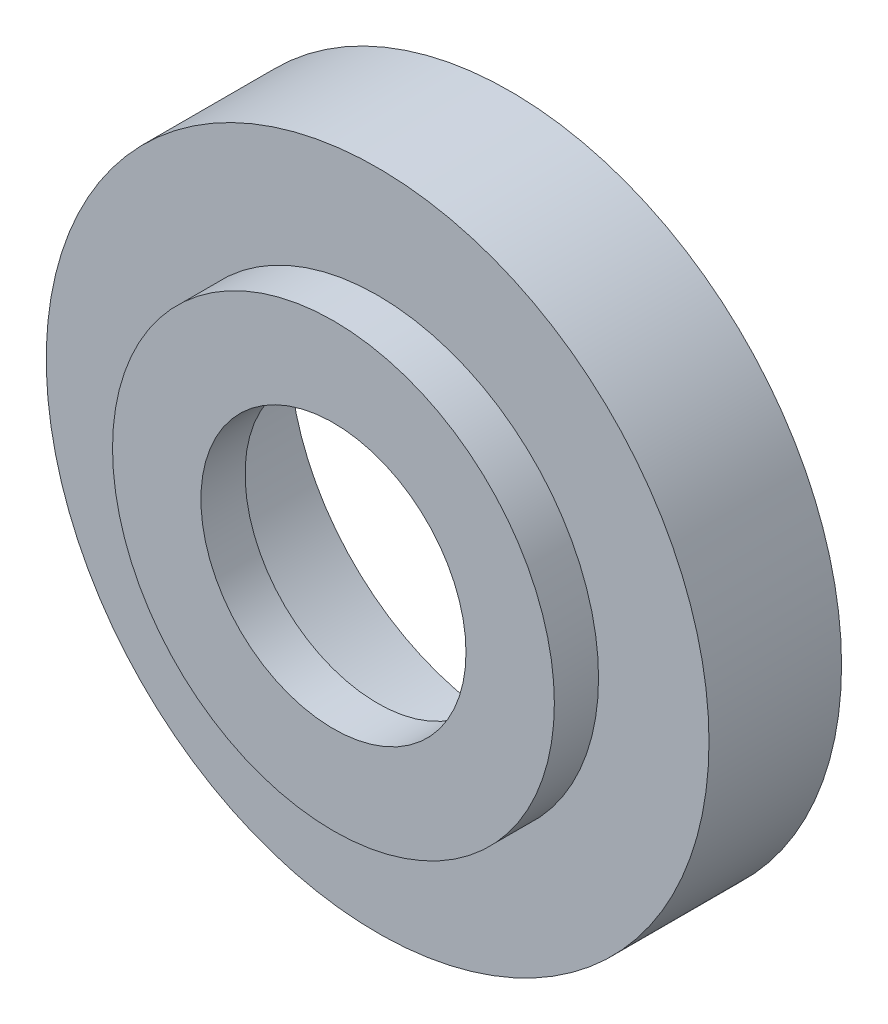
ISO-10303-21;
HEADER;
FILE_DESCRIPTION(('STEP AP214'),'2;1');
FILE_NAME('part.step','',(''),(''),'','','');
FILE_SCHEMA(('AUTOMOTIVE_DESIGN { 1 0 10303 214 1 1 1 1 }'));
ENDSEC;
DATA;
#1=APPLICATION_CONTEXT('core data for automotive mechanical design processes');
#2=APPLICATION_PROTOCOL_DEFINITION('international standard','automotive_design',2000,#1);
#3=PRODUCT_CONTEXT('',#1,'mechanical');
#4=PRODUCT('Part','Part','',(#3));
#5=PRODUCT_RELATED_PRODUCT_CATEGORY('part','',(#4));
#6=PRODUCT_DEFINITION_FORMATION('','',#4);
#7=PRODUCT_DEFINITION_CONTEXT('part definition',#1,'design');
#8=PRODUCT_DEFINITION('design','',#6,#7);
#9=PRODUCT_DEFINITION_SHAPE('','',#8);
#10=(LENGTH_UNIT() NAMED_UNIT(*) SI_UNIT(.MILLI.,.METRE.));
#11=(NAMED_UNIT(*) PLANE_ANGLE_UNIT() SI_UNIT($,.RADIAN.));
#12=(NAMED_UNIT(*) SI_UNIT($,.STERADIAN.) SOLID_ANGLE_UNIT());
#13=UNCERTAINTY_MEASURE_WITH_UNIT(LENGTH_MEASURE(1.E-05),#10,'distance_accuracy_value','');
#14=(GEOMETRIC_REPRESENTATION_CONTEXT(3) GLOBAL_UNCERTAINTY_ASSIGNED_CONTEXT((#13)) GLOBAL_UNIT_ASSIGNED_CONTEXT((#10,
#11,#12)) REPRESENTATION_CONTEXT('',''));
#15=CARTESIAN_POINT('',(0.,0.,0.));
#16=DIRECTION('',(0.,0.,1.));
#17=DIRECTION('',(1.,0.,0.));
#18=AXIS2_PLACEMENT_3D('',#15,#16,#17);
#19=CARTESIAN_POINT('',(0.,0.,2.));
#20=DIRECTION('',(0.,0.,1.));
#21=DIRECTION('',(1.,0.,0.));
#22=AXIS2_PLACEMENT_3D('',#19,#20,#21);
#23=PLANE('',#22);
#24=CARTESIAN_POINT('',(0.,0.,2.));
#25=DIRECTION('',(0.,0.,1.));
#26=DIRECTION('',(1.,0.,0.));
#27=AXIS2_PLACEMENT_3D('',#24,#25,#26);
#28=CIRCLE('',#27,2.5);
#29=CARTESIAN_POINT('',(2.5,0.,2.));
#30=VERTEX_POINT('',#29);
#31=EDGE_CURVE('E12',#30,#30,#28,.T.);
#32=ORIENTED_EDGE('',*,*,#31,.T.);
#33=EDGE_LOOP('',(#32));
#34=FACE_BOUND('',#33,.T.);
#35=CARTESIAN_POINT('',(0.,0.,2.));
#36=DIRECTION('',(0.,0.,1.));
#37=DIRECTION('',(1.,0.,0.));
#38=AXIS2_PLACEMENT_3D('',#35,#36,#37);
#39=CIRCLE('',#38,1.5);
#40=CARTESIAN_POINT('',(1.5,0.,2.));
#41=VERTEX_POINT('',#40);
#42=EDGE_CURVE('E70',#41,#41,#39,.T.);
#43=ORIENTED_EDGE('',*,*,#42,.F.);
#44=EDGE_LOOP('',(#43));
#45=FACE_BOUND('',#44,.T.);
#46=ADVANCED_FACE('F59',(#34,#45),#23,.T.);
#47=CARTESIAN_POINT('',(0.,0.,1.5));
#48=DIRECTION('',(0.,0.,1.));
#49=DIRECTION('',(1.,0.,0.));
#50=AXIS2_PLACEMENT_3D('',#47,#48,#49);
#51=PLANE('',#50);
#52=CARTESIAN_POINT('',(0.,0.,1.5));
#53=DIRECTION('',(0.,0.,1.));
#54=DIRECTION('',(1.,0.,0.));
#55=AXIS2_PLACEMENT_3D('',#52,#53,#54);
#56=CIRCLE('',#55,2.5);
#57=CARTESIAN_POINT('',(2.5,0.,1.5));
#58=VERTEX_POINT('',#57);
#59=EDGE_CURVE('E63',#58,#58,#56,.T.);
#60=ORIENTED_EDGE('',*,*,#59,.F.);
#61=EDGE_LOOP('',(#60));
#62=FACE_BOUND('',#61,.T.);
#63=CARTESIAN_POINT('',(0.,0.,1.5));
#64=DIRECTION('',(0.,0.,1.));
#65=DIRECTION('',(1.,0.,0.));
#66=AXIS2_PLACEMENT_3D('',#63,#64,#65);
#67=CIRCLE('',#66,1.5);
#68=CARTESIAN_POINT('',(1.5,0.,1.5));
#69=VERTEX_POINT('',#68);
#70=EDGE_CURVE('E72',#69,#69,#67,.T.);
#71=ORIENTED_EDGE('',*,*,#70,.T.);
#72=EDGE_LOOP('',(#71));
#73=FACE_BOUND('',#72,.T.);
#74=ADVANCED_FACE('F82',(#62,#73),#51,.F.);
#75=CARTESIAN_POINT('',(0.,0.,2.));
#76=DIRECTION('',(0.,0.,-1.));
#77=DIRECTION('',(-1.,0.,0.));
#78=AXIS2_PLACEMENT_3D('',#75,#76,#77);
#79=CYLINDRICAL_SURFACE('',#78,2.5);
#80=ORIENTED_EDGE('',*,*,#31,.F.);
#81=EDGE_LOOP('',(#80));
#82=FACE_BOUND('',#81,.T.);
#83=ORIENTED_EDGE('',*,*,#59,.T.);
#84=EDGE_LOOP('',(#83));
#85=FACE_BOUND('',#84,.T.);
#86=ADVANCED_FACE('F61',(#82,#85),#79,.T.);
#87=CARTESIAN_POINT('',(0.,0.,2.));
#88=DIRECTION('',(0.,0.,-1.));
#89=DIRECTION('',(-1.,0.,0.));
#90=AXIS2_PLACEMENT_3D('',#87,#88,#89);
#91=CYLINDRICAL_SURFACE('',#90,1.5);
#92=ORIENTED_EDGE('',*,*,#42,.T.);
#93=EDGE_LOOP('',(#92));
#94=FACE_BOUND('',#93,.T.);
#95=ORIENTED_EDGE('',*,*,#70,.F.);
#96=EDGE_LOOP('',(#95));
#97=FACE_BOUND('',#96,.T.);
#98=ADVANCED_FACE('F78',(#94,#97),#91,.F.);
#99=CLOSED_SHELL('',(#46,#74,#86,#98));
#100=MANIFOLD_SOLID_BREP('B2',#99);
#101=CARTESIAN_POINT('',(0.,0.,1.5));
#102=DIRECTION('',(0.,0.,-1.));
#103=DIRECTION('',(-1.,0.,0.));
#104=AXIS2_PLACEMENT_3D('',#101,#102,#103);
#105=CYLINDRICAL_SURFACE('',#104,2.5);
#106=CARTESIAN_POINT('',(0.,0.,1.5));
#107=DIRECTION('',(0.,0.,1.));
#108=DIRECTION('',(1.,0.,0.));
#109=AXIS2_PLACEMENT_3D('',#106,#107,#108);
#110=CIRCLE('',#109,2.5);
#111=CARTESIAN_POINT('',(2.5,0.,1.5));
#112=VERTEX_POINT('',#111);
#113=EDGE_CURVE('E139',#112,#112,#110,.T.);
#114=ORIENTED_EDGE('',*,*,#113,.T.);
#115=EDGE_LOOP('',(#114));
#116=FACE_BOUND('',#115,.T.);
#117=CARTESIAN_POINT('',(0.,0.,0.));
#118=DIRECTION('',(0.,0.,1.));
#119=DIRECTION('',(1.,0.,0.));
#120=AXIS2_PLACEMENT_3D('',#117,#118,#119);
#121=CIRCLE('',#120,2.5);
#122=CARTESIAN_POINT('',(2.5,0.,0.));
#123=VERTEX_POINT('',#122);
#124=EDGE_CURVE('E146',#123,#123,#121,.T.);
#125=ORIENTED_EDGE('',*,*,#124,.F.);
#126=EDGE_LOOP('',(#125));
#127=FACE_BOUND('',#126,.T.);
#128=ADVANCED_FACE('F131',(#116,#127),#105,.F.);
#129=CARTESIAN_POINT('',(0.,0.,1.5));
#130=DIRECTION('',(0.,0.,-1.));
#131=DIRECTION('',(-1.,0.,0.));
#132=AXIS2_PLACEMENT_3D('',#129,#130,#131);
#133=CYLINDRICAL_SURFACE('',#132,3.75);
#134=CARTESIAN_POINT('',(0.,0.,1.5));
#135=DIRECTION('',(0.,0.,1.));
#136=DIRECTION('',(1.,0.,0.));
#137=AXIS2_PLACEMENT_3D('',#134,#135,#136);
#138=CIRCLE('',#137,3.75);
#139=CARTESIAN_POINT('',(3.75,0.,1.5));
#140=VERTEX_POINT('',#139);
#141=EDGE_CURVE('E58',#140,#140,#138,.T.);
#142=ORIENTED_EDGE('',*,*,#141,.F.);
#143=EDGE_LOOP('',(#142));
#144=FACE_BOUND('',#143,.T.);
#145=CARTESIAN_POINT('',(0.,0.,0.));
#146=DIRECTION('',(0.,0.,1.));
#147=DIRECTION('',(1.,0.,0.));
#148=AXIS2_PLACEMENT_3D('',#145,#146,#147);
#149=CIRCLE('',#148,3.75);
#150=CARTESIAN_POINT('',(3.75,0.,0.));
#151=VERTEX_POINT('',#150);
#152=EDGE_CURVE('E134',#151,#151,#149,.T.);
#153=ORIENTED_EDGE('',*,*,#152,.T.);
#154=EDGE_LOOP('',(#153));
#155=FACE_BOUND('',#154,.T.);
#156=ADVANCED_FACE('F155',(#144,#155),#133,.T.);
#157=CARTESIAN_POINT('',(0.,0.,1.5));
#158=DIRECTION('',(0.,0.,1.));
#159=DIRECTION('',(1.,0.,0.));
#160=AXIS2_PLACEMENT_3D('',#157,#158,#159);
#161=PLANE('',#160);
#162=ORIENTED_EDGE('',*,*,#113,.F.);
#163=EDGE_LOOP('',(#162));
#164=FACE_BOUND('',#163,.T.);
#165=ORIENTED_EDGE('',*,*,#141,.T.);
#166=EDGE_LOOP('',(#165));
#167=FACE_BOUND('',#166,.T.);
#168=ADVANCED_FACE('F159',(#164,#167),#161,.T.);
#169=CARTESIAN_POINT('',(0.,0.,0.));
#170=DIRECTION('',(0.,0.,1.));
#171=DIRECTION('',(1.,0.,0.));
#172=AXIS2_PLACEMENT_3D('',#169,#170,#171);
#173=PLANE('',#172);
#174=ORIENTED_EDGE('',*,*,#124,.T.);
#175=EDGE_LOOP('',(#174));
#176=FACE_BOUND('',#175,.T.);
#177=ORIENTED_EDGE('',*,*,#152,.F.);
#178=EDGE_LOOP('',(#177));
#179=FACE_BOUND('',#178,.T.);
#180=ADVANCED_FACE('F157',(#176,#179),#173,.F.);
#181=CLOSED_SHELL('',(#128,#156,#168,#180));
#182=MANIFOLD_SOLID_BREP('B7',#181);
#183=ADVANCED_BREP_SHAPE_REPRESENTATION('',(#18,#100,#182),#14);
#184=SHAPE_DEFINITION_REPRESENTATION(#9,#183);
ENDSEC;
END-ISO-10303-21;
